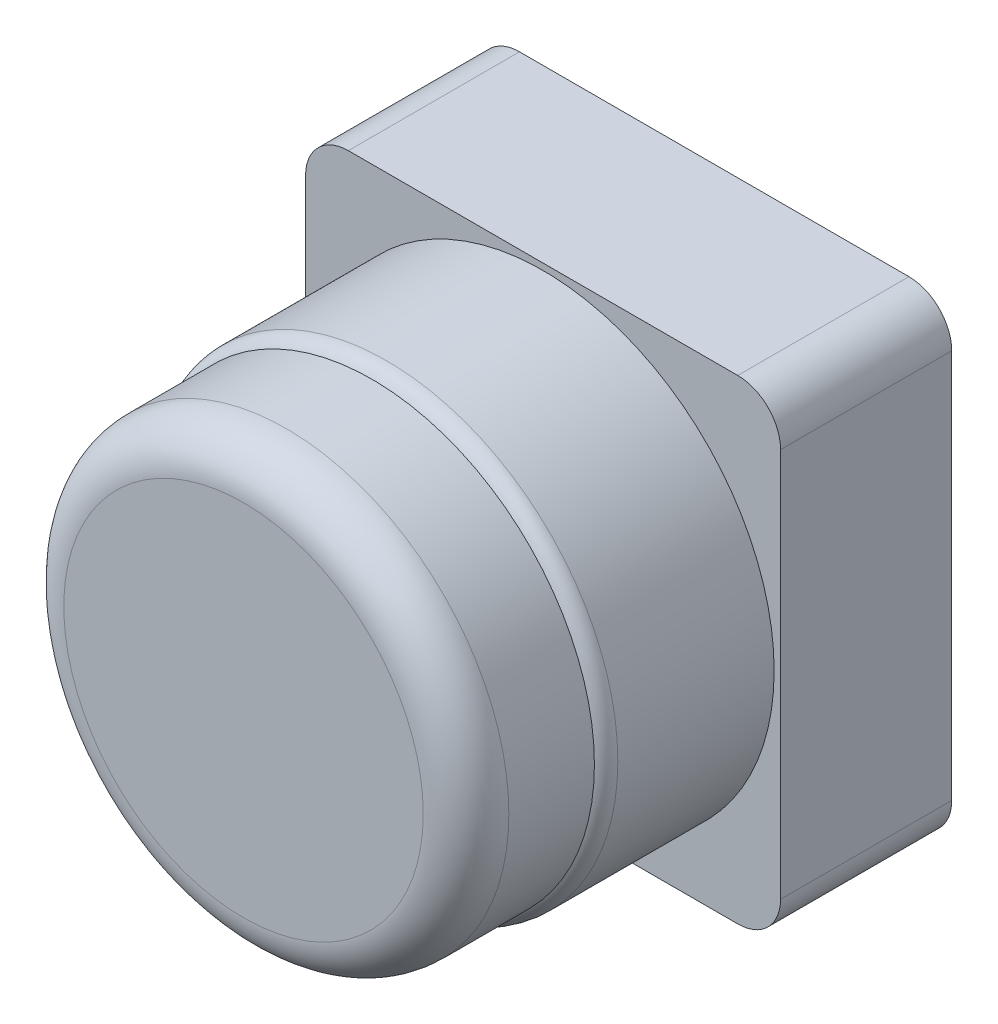
ISO-10303-21;
HEADER;
FILE_DESCRIPTION(('STEP AP214'),'2;1');
FILE_NAME('part.step','',(''),(''),'','','');
FILE_SCHEMA(('AUTOMOTIVE_DESIGN { 1 0 10303 214 1 1 1 1 }'));
ENDSEC;
DATA;
#1=APPLICATION_CONTEXT('core data for automotive mechanical design processes');
#2=APPLICATION_PROTOCOL_DEFINITION('international standard','automotive_design',2000,#1);
#3=PRODUCT_CONTEXT('',#1,'mechanical');
#4=PRODUCT('Part','Part','',(#3));
#5=PRODUCT_RELATED_PRODUCT_CATEGORY('part','',(#4));
#6=PRODUCT_DEFINITION_FORMATION('','',#4);
#7=PRODUCT_DEFINITION_CONTEXT('part definition',#1,'design');
#8=PRODUCT_DEFINITION('design','',#6,#7);
#9=PRODUCT_DEFINITION_SHAPE('','',#8);
#10=(LENGTH_UNIT() NAMED_UNIT(*) SI_UNIT(.MILLI.,.METRE.));
#11=(NAMED_UNIT(*) PLANE_ANGLE_UNIT() SI_UNIT($,.RADIAN.));
#12=(NAMED_UNIT(*) SI_UNIT($,.STERADIAN.) SOLID_ANGLE_UNIT());
#13=UNCERTAINTY_MEASURE_WITH_UNIT(LENGTH_MEASURE(1.E-05),#10,'distance_accuracy_value','');
#14=(GEOMETRIC_REPRESENTATION_CONTEXT(3) GLOBAL_UNCERTAINTY_ASSIGNED_CONTEXT((#13)) GLOBAL_UNIT_ASSIGNED_CONTEXT((#10,
#11,#12)) REPRESENTATION_CONTEXT('',''));
#15=CARTESIAN_POINT('',(0.,0.,0.));
#16=DIRECTION('',(0.,0.,1.));
#17=DIRECTION('',(1.,0.,0.));
#18=AXIS2_PLACEMENT_3D('',#15,#16,#17);
#19=CARTESIAN_POINT('',(-27.75,27.75,20.));
#20=DIRECTION('',(1.,0.,0.));
#21=DIRECTION('',(0.,1.,0.));
#22=AXIS2_PLACEMENT_3D('',#19,#20,#21);
#23=PLANE('',#22);
#24=DIRECTION('',(0.,-1.,0.));
#25=VECTOR('',#24,1.);
#26=CARTESIAN_POINT('',(-27.75,27.75,20.));
#27=LINE('',#26,#25);
#28=CARTESIAN_POINT('',(-27.75,22.75,20.));
#29=VERTEX_POINT('',#28);
#30=CARTESIAN_POINT('',(-27.75,-22.75,20.));
#31=VERTEX_POINT('',#30);
#32=EDGE_CURVE('E205',#29,#31,#27,.T.);
#33=ORIENTED_EDGE('',*,*,#32,.F.);
#34=DIRECTION('',(0.,0.,-1.));
#35=VECTOR('',#34,1.);
#36=CARTESIAN_POINT('',(-27.75,22.75,20.));
#37=LINE('',#36,#35);
#38=CARTESIAN_POINT('',(-27.75,22.75,0.));
#39=VERTEX_POINT('',#38);
#40=EDGE_CURVE('E235',#29,#39,#37,.T.);
#41=ORIENTED_EDGE('',*,*,#40,.T.);
#42=DIRECTION('',(0.,-1.,0.));
#43=VECTOR('',#42,1.);
#44=CARTESIAN_POINT('',(-27.75,27.75,0.));
#45=LINE('',#44,#43);
#46=CARTESIAN_POINT('',(-27.75,-22.75,0.));
#47=VERTEX_POINT('',#46);
#48=EDGE_CURVE('E194',#39,#47,#45,.T.);
#49=ORIENTED_EDGE('',*,*,#48,.T.);
#50=DIRECTION('',(0.,0.,-1.));
#51=VECTOR('',#50,1.);
#52=CARTESIAN_POINT('',(-27.75,-22.75,20.));
#53=LINE('',#52,#51);
#54=EDGE_CURVE('E233',#47,#31,#53,.F.);
#55=ORIENTED_EDGE('',*,*,#54,.T.);
#56=EDGE_LOOP('',(#33,#41,#49,#55));
#57=FACE_BOUND('',#56,.T.);
#58=ADVANCED_FACE('F38',(#57),#23,.F.);
#59=CARTESIAN_POINT('',(-27.75,-27.75,20.));
#60=DIRECTION('',(0.,1.,0.));
#61=DIRECTION('',(0.,0.,1.));
#62=AXIS2_PLACEMENT_3D('',#59,#60,#61);
#63=PLANE('',#62);
#64=DIRECTION('',(0.,0.,-1.));
#65=VECTOR('',#64,1.);
#66=CARTESIAN_POINT('',(5.,-27.75,0.));
#67=LINE('',#66,#65);
#68=CARTESIAN_POINT('',(5.,-27.75,5.));
#69=VERTEX_POINT('',#68);
#70=CARTESIAN_POINT('',(5.,-27.75,1.));
#71=VERTEX_POINT('',#70);
#72=EDGE_CURVE('E157',#69,#71,#67,.T.);
#73=ORIENTED_EDGE('',*,*,#72,.T.);
#74=DIRECTION('',(1.,0.,0.));
#75=VECTOR('',#74,1.);
#76=CARTESIAN_POINT('',(0.,-27.75,1.));
#77=LINE('',#76,#75);
#78=CARTESIAN_POINT('',(-5.,-27.75,1.));
#79=VERTEX_POINT('',#78);
#80=EDGE_CURVE('E53',#79,#71,#77,.T.);
#81=ORIENTED_EDGE('',*,*,#80,.F.);
#82=DIRECTION('',(0.,0.,-1.));
#83=VECTOR('',#82,1.);
#84=CARTESIAN_POINT('',(-5.,-27.75,0.));
#85=LINE('',#84,#83);
#86=CARTESIAN_POINT('',(-5.,-27.75,5.));
#87=VERTEX_POINT('',#86);
#88=EDGE_CURVE('E148',#87,#79,#85,.T.);
#89=ORIENTED_EDGE('',*,*,#88,.F.);
#90=DIRECTION('',(1.,0.,0.));
#91=VECTOR('',#90,1.);
#92=CARTESIAN_POINT('',(0.,-27.75,5.));
#93=LINE('',#92,#91);
#94=EDGE_CURVE('E151',#87,#69,#93,.T.);
#95=ORIENTED_EDGE('',*,*,#94,.T.);
#96=EDGE_LOOP('',(#73,#81,#89,#95));
#97=FACE_BOUND('',#96,.T.);
#98=DIRECTION('',(1.,0.,0.));
#99=VECTOR('',#98,1.);
#100=CARTESIAN_POINT('',(-27.75,-27.75,0.));
#101=LINE('',#100,#99);
#102=CARTESIAN_POINT('',(-22.75,-27.75,0.));
#103=VERTEX_POINT('',#102);
#104=CARTESIAN_POINT('',(22.75,-27.75,0.));
#105=VERTEX_POINT('',#104);
#106=EDGE_CURVE('E218',#103,#105,#101,.T.);
#107=ORIENTED_EDGE('',*,*,#106,.T.);
#108=DIRECTION('',(0.,0.,-1.));
#109=VECTOR('',#108,1.);
#110=CARTESIAN_POINT('',(22.75,-27.75,20.));
#111=LINE('',#110,#109);
#112=CARTESIAN_POINT('',(22.75,-27.75,20.));
#113=VERTEX_POINT('',#112);
#114=EDGE_CURVE('E11',#105,#113,#111,.F.);
#115=ORIENTED_EDGE('',*,*,#114,.T.);
#116=DIRECTION('',(1.,0.,0.));
#117=VECTOR('',#116,1.);
#118=CARTESIAN_POINT('',(-27.75,-27.75,20.));
#119=LINE('',#118,#117);
#120=CARTESIAN_POINT('',(-22.75,-27.75,20.));
#121=VERTEX_POINT('',#120);
#122=EDGE_CURVE('E208',#121,#113,#119,.T.);
#123=ORIENTED_EDGE('',*,*,#122,.F.);
#124=DIRECTION('',(0.,0.,-1.));
#125=VECTOR('',#124,1.);
#126=CARTESIAN_POINT('',(-22.75,-27.75,20.));
#127=LINE('',#126,#125);
#128=EDGE_CURVE('E46',#121,#103,#127,.T.);
#129=ORIENTED_EDGE('',*,*,#128,.T.);
#130=EDGE_LOOP('',(#107,#115,#123,#129));
#131=FACE_BOUND('',#130,.T.);
#132=ADVANCED_FACE('F267',(#97,#131),#63,.F.);
#133=CARTESIAN_POINT('',(27.75,27.75,20.));
#134=DIRECTION('',(-1.,0.,0.));
#135=DIRECTION('',(0.,-1.,0.));
#136=AXIS2_PLACEMENT_3D('',#133,#134,#135);
#137=PLANE('',#136);
#138=DIRECTION('',(0.,1.,0.));
#139=VECTOR('',#138,1.);
#140=CARTESIAN_POINT('',(27.75,27.75,0.));
#141=LINE('',#140,#139);
#142=CARTESIAN_POINT('',(27.75,-22.75,0.));
#143=VERTEX_POINT('',#142);
#144=CARTESIAN_POINT('',(27.75,22.75,0.));
#145=VERTEX_POINT('',#144);
#146=EDGE_CURVE('E221',#143,#145,#141,.T.);
#147=ORIENTED_EDGE('',*,*,#146,.T.);
#148=DIRECTION('',(0.,0.,-1.));
#149=VECTOR('',#148,1.);
#150=CARTESIAN_POINT('',(27.75,22.75,20.));
#151=LINE('',#150,#149);
#152=CARTESIAN_POINT('',(27.75,22.75,20.));
#153=VERTEX_POINT('',#152);
#154=EDGE_CURVE('E61',#145,#153,#151,.F.);
#155=ORIENTED_EDGE('',*,*,#154,.T.);
#156=DIRECTION('',(0.,1.,0.));
#157=VECTOR('',#156,1.);
#158=CARTESIAN_POINT('',(27.75,27.75,20.));
#159=LINE('',#158,#157);
#160=CARTESIAN_POINT('',(27.75,-22.75,20.));
#161=VERTEX_POINT('',#160);
#162=EDGE_CURVE('E212',#161,#153,#159,.T.);
#163=ORIENTED_EDGE('',*,*,#162,.F.);
#164=DIRECTION('',(0.,0.,-1.));
#165=VECTOR('',#164,1.);
#166=CARTESIAN_POINT('',(27.75,-22.75,20.));
#167=LINE('',#166,#165);
#168=EDGE_CURVE('E259',#161,#143,#167,.T.);
#169=ORIENTED_EDGE('',*,*,#168,.T.);
#170=EDGE_LOOP('',(#147,#155,#163,#169));
#171=FACE_BOUND('',#170,.T.);
#172=ADVANCED_FACE('F279',(#171),#137,.F.);
#173=CARTESIAN_POINT('',(-27.75,27.75,20.));
#174=DIRECTION('',(0.,-1.,0.));
#175=DIRECTION('',(0.,0.,-1.));
#176=AXIS2_PLACEMENT_3D('',#173,#174,#175);
#177=PLANE('',#176);
#178=DIRECTION('',(-1.,0.,0.));
#179=VECTOR('',#178,1.);
#180=CARTESIAN_POINT('',(-27.75,27.75,0.));
#181=LINE('',#180,#179);
#182=CARTESIAN_POINT('',(22.75,27.75,0.));
#183=VERTEX_POINT('',#182);
#184=CARTESIAN_POINT('',(-22.75,27.75,0.));
#185=VERTEX_POINT('',#184);
#186=EDGE_CURVE('E209',#183,#185,#181,.T.);
#187=ORIENTED_EDGE('',*,*,#186,.T.);
#188=DIRECTION('',(0.,0.,-1.));
#189=VECTOR('',#188,1.);
#190=CARTESIAN_POINT('',(-22.75,27.75,20.));
#191=LINE('',#190,#189);
#192=CARTESIAN_POINT('',(-22.75,27.75,20.));
#193=VERTEX_POINT('',#192);
#194=EDGE_CURVE('E249',#185,#193,#191,.F.);
#195=ORIENTED_EDGE('',*,*,#194,.T.);
#196=DIRECTION('',(-1.,0.,0.));
#197=VECTOR('',#196,1.);
#198=CARTESIAN_POINT('',(-27.75,27.75,20.));
#199=LINE('',#198,#197);
#200=CARTESIAN_POINT('',(22.75,27.75,20.));
#201=VERTEX_POINT('',#200);
#202=EDGE_CURVE('E204',#201,#193,#199,.T.);
#203=ORIENTED_EDGE('',*,*,#202,.F.);
#204=DIRECTION('',(0.,0.,-1.));
#205=VECTOR('',#204,1.);
#206=CARTESIAN_POINT('',(22.75,27.75,20.));
#207=LINE('',#206,#205);
#208=EDGE_CURVE('E246',#201,#183,#207,.T.);
#209=ORIENTED_EDGE('',*,*,#208,.T.);
#210=EDGE_LOOP('',(#187,#195,#203,#209));
#211=FACE_BOUND('',#210,.T.);
#212=ADVANCED_FACE('F289',(#211),#177,.F.);
#213=CARTESIAN_POINT('',(0.,0.,20.));
#214=DIRECTION('',(0.,0.,1.));
#215=DIRECTION('',(1.,0.,0.));
#216=AXIS2_PLACEMENT_3D('',#213,#214,#215);
#217=PLANE('',#216);
#218=CARTESIAN_POINT('',(0.,0.,20.));
#219=DIRECTION('',(0.,0.,1.));
#220=DIRECTION('',(1.,0.,0.));
#221=AXIS2_PLACEMENT_3D('',#218,#219,#220);
#222=CIRCLE('',#221,27.);
#223=CARTESIAN_POINT('',(27.,0.,20.));
#224=VERTEX_POINT('',#223);
#225=EDGE_CURVE('E201',#224,#224,#222,.T.);
#226=ORIENTED_EDGE('',*,*,#225,.F.);
#227=EDGE_LOOP('',(#226));
#228=FACE_BOUND('',#227,.T.);
#229=ORIENTED_EDGE('',*,*,#202,.T.);
#230=CARTESIAN_POINT('',(-22.75,22.75,20.));
#231=DIRECTION('',(0.,0.,1.));
#232=DIRECTION('',(1.,0.,0.));
#233=AXIS2_PLACEMENT_3D('',#230,#231,#232);
#234=CIRCLE('',#233,5.);
#235=EDGE_CURVE('E257',#193,#29,#234,.T.);
#236=ORIENTED_EDGE('',*,*,#235,.T.);
#237=ORIENTED_EDGE('',*,*,#32,.T.);
#238=CARTESIAN_POINT('',(-22.75,-22.75,20.));
#239=DIRECTION('',(0.,0.,1.));
#240=DIRECTION('',(1.,0.,0.));
#241=AXIS2_PLACEMENT_3D('',#238,#239,#240);
#242=CIRCLE('',#241,5.);
#243=EDGE_CURVE('E251',#31,#121,#242,.T.);
#244=ORIENTED_EDGE('',*,*,#243,.T.);
#245=ORIENTED_EDGE('',*,*,#122,.T.);
#246=CARTESIAN_POINT('',(22.75,-22.75,20.));
#247=DIRECTION('',(0.,0.,1.));
#248=DIRECTION('',(1.,0.,0.));
#249=AXIS2_PLACEMENT_3D('',#246,#247,#248);
#250=CIRCLE('',#249,5.);
#251=EDGE_CURVE('E253',#113,#161,#250,.T.);
#252=ORIENTED_EDGE('',*,*,#251,.T.);
#253=ORIENTED_EDGE('',*,*,#162,.T.);
#254=CARTESIAN_POINT('',(22.75,22.75,20.));
#255=DIRECTION('',(0.,0.,1.));
#256=DIRECTION('',(1.,0.,0.));
#257=AXIS2_PLACEMENT_3D('',#254,#255,#256);
#258=CIRCLE('',#257,5.);
#259=EDGE_CURVE('E255',#153,#201,#258,.T.);
#260=ORIENTED_EDGE('',*,*,#259,.T.);
#261=EDGE_LOOP('',(#229,#236,#237,#244,#245,#252,#253,#260));
#262=FACE_BOUND('',#261,.T.);
#263=ADVANCED_FACE('F282',(#228,#262),#217,.T.);
#264=CARTESIAN_POINT('',(0.,0.,0.));
#265=DIRECTION('',(0.,0.,1.));
#266=DIRECTION('',(1.,0.,0.));
#267=AXIS2_PLACEMENT_3D('',#264,#265,#266);
#268=PLANE('',#267);
#269=CARTESIAN_POINT('',(21.75,-21.75,0.));
#270=DIRECTION('',(0.,0.,-1.));
#271=DIRECTION('',(1.,0.,0.));
#272=AXIS2_PLACEMENT_3D('',#269,#270,#271);
#273=CIRCLE('',#272,1.5);
#274=CARTESIAN_POINT('',(23.25,-21.75,0.));
#275=VERTEX_POINT('',#274);
#276=EDGE_CURVE('E186',#275,#275,#273,.T.);
#277=ORIENTED_EDGE('',*,*,#276,.F.);
#278=EDGE_LOOP('',(#277));
#279=FACE_BOUND('',#278,.T.);
#280=CARTESIAN_POINT('',(-21.75,-21.75,0.));
#281=DIRECTION('',(0.,0.,-1.));
#282=DIRECTION('',(-1.,0.,0.));
#283=AXIS2_PLACEMENT_3D('',#280,#281,#282);
#284=CIRCLE('',#283,1.5);
#285=CARTESIAN_POINT('',(-23.25,-21.75,0.));
#286=VERTEX_POINT('',#285);
#287=EDGE_CURVE('E180',#286,#286,#284,.T.);
#288=ORIENTED_EDGE('',*,*,#287,.F.);
#289=EDGE_LOOP('',(#288));
#290=FACE_BOUND('',#289,.T.);
#291=CARTESIAN_POINT('',(-21.75,21.75,0.));
#292=DIRECTION('',(0.,0.,-1.));
#293=DIRECTION('',(1.,0.,0.));
#294=AXIS2_PLACEMENT_3D('',#291,#292,#293);
#295=CIRCLE('',#294,1.5);
#296=CARTESIAN_POINT('',(-20.25,21.75,0.));
#297=VERTEX_POINT('',#296);
#298=EDGE_CURVE('E174',#297,#297,#295,.T.);
#299=ORIENTED_EDGE('',*,*,#298,.F.);
#300=EDGE_LOOP('',(#299));
#301=FACE_BOUND('',#300,.T.);
#302=CARTESIAN_POINT('',(21.75,21.75,0.));
#303=DIRECTION('',(0.,0.,-1.));
#304=DIRECTION('',(-1.,0.,0.));
#305=AXIS2_PLACEMENT_3D('',#302,#303,#304);
#306=CIRCLE('',#305,1.5);
#307=CARTESIAN_POINT('',(20.25,21.75,0.));
#308=VERTEX_POINT('',#307);
#309=EDGE_CURVE('E167',#308,#308,#306,.T.);
#310=ORIENTED_EDGE('',*,*,#309,.F.);
#311=EDGE_LOOP('',(#310));
#312=FACE_BOUND('',#311,.T.);
#313=CARTESIAN_POINT('',(0.,0.,0.));
#314=DIRECTION('',(0.,0.,-1.));
#315=DIRECTION('',(-1.,0.,0.));
#316=AXIS2_PLACEMENT_3D('',#313,#314,#315);
#317=CIRCLE('',#316,1.5);
#318=CARTESIAN_POINT('',(-1.5,0.,0.));
#319=VERTEX_POINT('',#318);
#320=EDGE_CURVE('E170',#319,#319,#317,.T.);
#321=ORIENTED_EDGE('',*,*,#320,.F.);
#322=EDGE_LOOP('',(#321));
#323=FACE_BOUND('',#322,.T.);
#324=ORIENTED_EDGE('',*,*,#48,.F.);
#325=CARTESIAN_POINT('',(-22.75,22.75,0.));
#326=DIRECTION('',(0.,0.,1.));
#327=DIRECTION('',(1.,0.,0.));
#328=AXIS2_PLACEMENT_3D('',#325,#326,#327);
#329=CIRCLE('',#328,5.);
#330=EDGE_CURVE('E244',#39,#185,#329,.F.);
#331=ORIENTED_EDGE('',*,*,#330,.T.);
#332=ORIENTED_EDGE('',*,*,#186,.F.);
#333=CARTESIAN_POINT('',(22.75,22.75,0.));
#334=DIRECTION('',(0.,0.,1.));
#335=DIRECTION('',(1.,0.,0.));
#336=AXIS2_PLACEMENT_3D('',#333,#334,#335);
#337=CIRCLE('',#336,5.);
#338=EDGE_CURVE('E242',#183,#145,#337,.F.);
#339=ORIENTED_EDGE('',*,*,#338,.T.);
#340=ORIENTED_EDGE('',*,*,#146,.F.);
#341=CARTESIAN_POINT('',(22.75,-22.75,0.));
#342=DIRECTION('',(0.,0.,1.));
#343=DIRECTION('',(1.,0.,0.));
#344=AXIS2_PLACEMENT_3D('',#341,#342,#343);
#345=CIRCLE('',#344,5.);
#346=EDGE_CURVE('E240',#143,#105,#345,.F.);
#347=ORIENTED_EDGE('',*,*,#346,.T.);
#348=ORIENTED_EDGE('',*,*,#106,.F.);
#349=CARTESIAN_POINT('',(-22.75,-22.75,0.));
#350=DIRECTION('',(0.,0.,1.));
#351=DIRECTION('',(1.,0.,0.));
#352=AXIS2_PLACEMENT_3D('',#349,#350,#351);
#353=CIRCLE('',#352,5.);
#354=EDGE_CURVE('E238',#103,#47,#353,.F.);
#355=ORIENTED_EDGE('',*,*,#354,.T.);
#356=EDGE_LOOP('',(#324,#331,#332,#339,#340,#347,#348,#355));
#357=FACE_BOUND('',#356,.T.);
#358=ADVANCED_FACE('F273',(#279,#290,#301,#312,#323,#357),#268,.F.);
#359=CARTESIAN_POINT('',(0.,0.,40.));
#360=DIRECTION('',(0.,0.,-1.));
#361=DIRECTION('',(-1.,0.,0.));
#362=AXIS2_PLACEMENT_3D('',#359,#360,#361);
#363=CYLINDRICAL_SURFACE('',#362,27.);
#364=CARTESIAN_POINT('',(0.,0.,38.2679491924311));
#365=DIRECTION('',(0.,0.,1.));
#366=DIRECTION('',(1.,0.,0.));
#367=AXIS2_PLACEMENT_3D('',#364,#365,#366);
#368=CIRCLE('',#367,27.);
#369=CARTESIAN_POINT('',(27.,0.,38.2679491924311));
#370=VERTEX_POINT('',#369);
#371=EDGE_CURVE('E230',#370,#370,#368,.F.);
#372=ORIENTED_EDGE('',*,*,#371,.T.);
#373=EDGE_LOOP('',(#372));
#374=FACE_BOUND('',#373,.T.);
#375=ORIENTED_EDGE('',*,*,#225,.T.);
#376=EDGE_LOOP('',(#375));
#377=FACE_BOUND('',#376,.T.);
#378=ADVANCED_FACE('F353',(#374,#377),#363,.T.);
#379=CARTESIAN_POINT('',(0.,0.,55.));
#380=DIRECTION('',(0.,0.,-1.));
#381=DIRECTION('',(-1.,0.,0.));
#382=AXIS2_PLACEMENT_3D('',#379,#380,#381);
#383=CYLINDRICAL_SURFACE('',#382,26.);
#384=CARTESIAN_POINT('',(0.,0.,50.));
#385=DIRECTION('',(0.,0.,1.));
#386=DIRECTION('',(1.,0.,0.));
#387=AXIS2_PLACEMENT_3D('',#384,#385,#386);
#388=CIRCLE('',#387,26.);
#389=CARTESIAN_POINT('',(26.,0.,50.));
#390=VERTEX_POINT('',#389);
#391=EDGE_CURVE('E227',#390,#390,#388,.F.);
#392=ORIENTED_EDGE('',*,*,#391,.T.);
#393=EDGE_LOOP('',(#392));
#394=FACE_BOUND('',#393,.T.);
#395=CARTESIAN_POINT('',(0.,0.,40.));
#396=DIRECTION('',(0.,0.,1.));
#397=DIRECTION('',(1.,0.,0.));
#398=AXIS2_PLACEMENT_3D('',#395,#396,#397);
#399=CIRCLE('',#398,26.);
#400=CARTESIAN_POINT('',(26.,0.,40.));
#401=VERTEX_POINT('',#400);
#402=EDGE_CURVE('E197',#401,#401,#399,.T.);
#403=ORIENTED_EDGE('',*,*,#402,.T.);
#404=EDGE_LOOP('',(#403));
#405=FACE_BOUND('',#404,.T.);
#406=ADVANCED_FACE('F575',(#394,#405),#383,.T.);
#407=CARTESIAN_POINT('',(0.,0.,55.));
#408=DIRECTION('',(0.,0.,1.));
#409=DIRECTION('',(1.,0.,0.));
#410=AXIS2_PLACEMENT_3D('',#407,#408,#409);
#411=PLANE('',#410);
#412=CARTESIAN_POINT('',(0.,0.,55.));
#413=DIRECTION('',(0.,0.,1.));
#414=DIRECTION('',(1.,0.,0.));
#415=AXIS2_PLACEMENT_3D('',#412,#413,#414);
#416=CIRCLE('',#415,21.);
#417=CARTESIAN_POINT('',(21.,0.,55.));
#418=VERTEX_POINT('',#417);
#419=EDGE_CURVE('E200',#418,#418,#416,.T.);
#420=ORIENTED_EDGE('',*,*,#419,.T.);
#421=EDGE_LOOP('',(#420));
#422=FACE_BOUND('',#421,.T.);
#423=ADVANCED_FACE('F321',(#422),#411,.T.);
#424=CARTESIAN_POINT('',(0.,0.,50.));
#425=DIRECTION('',(0.,0.,1.));
#426=DIRECTION('',(1.,0.,0.));
#427=AXIS2_PLACEMENT_3D('',#424,#425,#426);
#428=TOROIDAL_SURFACE('',#427,21.,5.);
#429=ORIENTED_EDGE('',*,*,#391,.F.);
#430=EDGE_LOOP('',(#429));
#431=FACE_BOUND('',#430,.T.);
#432=ORIENTED_EDGE('',*,*,#419,.F.);
#433=EDGE_LOOP('',(#432));
#434=FACE_BOUND('',#433,.T.);
#435=ADVANCED_FACE('F317',(#431,#434),#428,.T.);
#436=CARTESIAN_POINT('',(0.,0.,38.2679491924311));
#437=DIRECTION('',(0.,0.,1.));
#438=DIRECTION('',(1.,0.,0.));
#439=AXIS2_PLACEMENT_3D('',#436,#437,#438);
#440=TOROIDAL_SURFACE('',#439,25.,2.);
#441=ORIENTED_EDGE('',*,*,#371,.F.);
#442=EDGE_LOOP('',(#441));
#443=FACE_BOUND('',#442,.T.);
#444=ORIENTED_EDGE('',*,*,#402,.F.);
#445=EDGE_LOOP('',(#444));
#446=FACE_BOUND('',#445,.T.);
#447=ADVANCED_FACE('F320',(#443,#446),#440,.T.);
#448=CARTESIAN_POINT('',(-22.75,22.75,20.));
#449=DIRECTION('',(0.,0.,-1.));
#450=DIRECTION('',(-1.,0.,0.));
#451=AXIS2_PLACEMENT_3D('',#448,#449,#450);
#452=CYLINDRICAL_SURFACE('',#451,5.);
#453=ORIENTED_EDGE('',*,*,#235,.F.);
#454=ORIENTED_EDGE('',*,*,#194,.F.);
#455=ORIENTED_EDGE('',*,*,#330,.F.);
#456=ORIENTED_EDGE('',*,*,#40,.F.);
#457=EDGE_LOOP('',(#453,#454,#455,#456));
#458=FACE_BOUND('',#457,.T.);
#459=ADVANCED_FACE('F294',(#458),#452,.T.);
#460=CARTESIAN_POINT('',(22.75,22.75,20.));
#461=DIRECTION('',(0.,0.,-1.));
#462=DIRECTION('',(-1.,0.,0.));
#463=AXIS2_PLACEMENT_3D('',#460,#461,#462);
#464=CYLINDRICAL_SURFACE('',#463,5.);
#465=ORIENTED_EDGE('',*,*,#259,.F.);
#466=ORIENTED_EDGE('',*,*,#154,.F.);
#467=ORIENTED_EDGE('',*,*,#338,.F.);
#468=ORIENTED_EDGE('',*,*,#208,.F.);
#469=EDGE_LOOP('',(#465,#466,#467,#468));
#470=FACE_BOUND('',#469,.T.);
#471=ADVANCED_FACE('F286',(#470),#464,.T.);
#472=CARTESIAN_POINT('',(22.75,-22.75,20.));
#473=DIRECTION('',(0.,0.,-1.));
#474=DIRECTION('',(-1.,0.,0.));
#475=AXIS2_PLACEMENT_3D('',#472,#473,#474);
#476=CYLINDRICAL_SURFACE('',#475,5.);
#477=ORIENTED_EDGE('',*,*,#251,.F.);
#478=ORIENTED_EDGE('',*,*,#114,.F.);
#479=ORIENTED_EDGE('',*,*,#346,.F.);
#480=ORIENTED_EDGE('',*,*,#168,.F.);
#481=EDGE_LOOP('',(#477,#478,#479,#480));
#482=FACE_BOUND('',#481,.T.);
#483=ADVANCED_FACE('F278',(#482),#476,.T.);
#484=CARTESIAN_POINT('',(-22.75,-22.75,20.));
#485=DIRECTION('',(0.,0.,-1.));
#486=DIRECTION('',(-1.,0.,0.));
#487=AXIS2_PLACEMENT_3D('',#484,#485,#486);
#488=CYLINDRICAL_SURFACE('',#487,5.);
#489=ORIENTED_EDGE('',*,*,#243,.F.);
#490=ORIENTED_EDGE('',*,*,#54,.F.);
#491=ORIENTED_EDGE('',*,*,#354,.F.);
#492=ORIENTED_EDGE('',*,*,#128,.F.);
#493=EDGE_LOOP('',(#489,#490,#491,#492));
#494=FACE_BOUND('',#493,.T.);
#495=ADVANCED_FACE('F40',(#494),#488,.T.);
#496=CARTESIAN_POINT('',(0.,0.,10.));
#497=DIRECTION('',(0.,0.,-1.));
#498=DIRECTION('',(-1.,0.,0.));
#499=AXIS2_PLACEMENT_3D('',#496,#497,#498);
#500=CYLINDRICAL_SURFACE('',#499,1.5);
#501=CARTESIAN_POINT('',(0.,0.,10.));
#502=DIRECTION('',(0.,0.,-1.));
#503=DIRECTION('',(-1.,0.,0.));
#504=AXIS2_PLACEMENT_3D('',#501,#502,#503);
#505=CIRCLE('',#504,1.5);
#506=CARTESIAN_POINT('',(-1.5,0.,10.));
#507=VERTEX_POINT('',#506);
#508=EDGE_CURVE('E191',#507,#507,#505,.T.);
#509=ORIENTED_EDGE('',*,*,#508,.F.);
#510=EDGE_LOOP('',(#509));
#511=FACE_BOUND('',#510,.T.);
#512=ORIENTED_EDGE('',*,*,#320,.T.);
#513=EDGE_LOOP('',(#512));
#514=FACE_BOUND('',#513,.T.);
#515=ADVANCED_FACE('F299',(#511,#514),#500,.F.);
#516=CARTESIAN_POINT('',(0.,0.,10.));
#517=DIRECTION('',(0.,0.,-1.));
#518=DIRECTION('',(-1.,0.,0.));
#519=AXIS2_PLACEMENT_3D('',#516,#517,#518);
#520=PLANE('',#519);
#521=ORIENTED_EDGE('',*,*,#508,.T.);
#522=EDGE_LOOP('',(#521));
#523=FACE_BOUND('',#522,.T.);
#524=ADVANCED_FACE('F304',(#523),#520,.T.);
#525=CARTESIAN_POINT('',(21.75,21.75,10.));
#526=DIRECTION('',(0.,0.,-1.));
#527=DIRECTION('',(-1.,0.,0.));
#528=AXIS2_PLACEMENT_3D('',#525,#526,#527);
#529=CYLINDRICAL_SURFACE('',#528,1.5);
#530=CARTESIAN_POINT('',(21.75,21.75,10.));
#531=DIRECTION('',(0.,0.,-1.));
#532=DIRECTION('',(-1.,0.,0.));
#533=AXIS2_PLACEMENT_3D('',#530,#531,#532);
#534=CIRCLE('',#533,1.5);
#535=CARTESIAN_POINT('',(20.25,21.75,10.));
#536=VERTEX_POINT('',#535);
#537=EDGE_CURVE('E171',#536,#536,#534,.T.);
#538=ORIENTED_EDGE('',*,*,#537,.F.);
#539=EDGE_LOOP('',(#538));
#540=FACE_BOUND('',#539,.T.);
#541=ORIENTED_EDGE('',*,*,#309,.T.);
#542=EDGE_LOOP('',(#541));
#543=FACE_BOUND('',#542,.T.);
#544=ADVANCED_FACE('F374',(#540,#543),#529,.F.);
#545=CARTESIAN_POINT('',(21.75,21.75,10.));
#546=DIRECTION('',(0.,0.,-1.));
#547=DIRECTION('',(-1.,0.,0.));
#548=AXIS2_PLACEMENT_3D('',#545,#546,#547);
#549=PLANE('',#548);
#550=ORIENTED_EDGE('',*,*,#537,.T.);
#551=EDGE_LOOP('',(#550));
#552=FACE_BOUND('',#551,.T.);
#553=ADVANCED_FACE('F385',(#552),#549,.T.);
#554=CARTESIAN_POINT('',(-21.75,21.75,10.));
#555=DIRECTION('',(0.,0.,-1.));
#556=DIRECTION('',(-1.,0.,0.));
#557=AXIS2_PLACEMENT_3D('',#554,#555,#556);
#558=CYLINDRICAL_SURFACE('',#557,1.5);
#559=CARTESIAN_POINT('',(-21.75,21.75,10.));
#560=DIRECTION('',(0.,0.,-1.));
#561=DIRECTION('',(1.,0.,0.));
#562=AXIS2_PLACEMENT_3D('',#559,#560,#561);
#563=CIRCLE('',#562,1.5);
#564=CARTESIAN_POINT('',(-20.25,21.75,10.));
#565=VERTEX_POINT('',#564);
#566=EDGE_CURVE('E177',#565,#565,#563,.T.);
#567=ORIENTED_EDGE('',*,*,#566,.F.);
#568=EDGE_LOOP('',(#567));
#569=FACE_BOUND('',#568,.T.);
#570=ORIENTED_EDGE('',*,*,#298,.T.);
#571=EDGE_LOOP('',(#570));
#572=FACE_BOUND('',#571,.T.);
#573=ADVANCED_FACE('F396',(#569,#572),#558,.F.);
#574=CARTESIAN_POINT('',(-21.75,21.75,10.));
#575=DIRECTION('',(0.,0.,1.));
#576=DIRECTION('',(1.,0.,0.));
#577=AXIS2_PLACEMENT_3D('',#574,#575,#576);
#578=PLANE('',#577);
#579=ORIENTED_EDGE('',*,*,#566,.T.);
#580=EDGE_LOOP('',(#579));
#581=FACE_BOUND('',#580,.T.);
#582=ADVANCED_FACE('F407',(#581),#578,.F.);
#583=CARTESIAN_POINT('',(-21.75,-21.75,10.));
#584=DIRECTION('',(0.,0.,-1.));
#585=DIRECTION('',(-1.,0.,0.));
#586=AXIS2_PLACEMENT_3D('',#583,#584,#585);
#587=CYLINDRICAL_SURFACE('',#586,1.5);
#588=CARTESIAN_POINT('',(-21.75,-21.75,10.));
#589=DIRECTION('',(0.,0.,-1.));
#590=DIRECTION('',(-1.,0.,0.));
#591=AXIS2_PLACEMENT_3D('',#588,#589,#590);
#592=CIRCLE('',#591,1.5);
#593=CARTESIAN_POINT('',(-23.25,-21.75,10.));
#594=VERTEX_POINT('',#593);
#595=EDGE_CURVE('E183',#594,#594,#592,.T.);
#596=ORIENTED_EDGE('',*,*,#595,.F.);
#597=EDGE_LOOP('',(#596));
#598=FACE_BOUND('',#597,.T.);
#599=ORIENTED_EDGE('',*,*,#287,.T.);
#600=EDGE_LOOP('',(#599));
#601=FACE_BOUND('',#600,.T.);
#602=ADVANCED_FACE('F418',(#598,#601),#587,.F.);
#603=CARTESIAN_POINT('',(-21.75,-21.75,10.));
#604=DIRECTION('',(0.,0.,-1.));
#605=DIRECTION('',(-1.,0.,0.));
#606=AXIS2_PLACEMENT_3D('',#603,#604,#605);
#607=PLANE('',#606);
#608=ORIENTED_EDGE('',*,*,#595,.T.);
#609=EDGE_LOOP('',(#608));
#610=FACE_BOUND('',#609,.T.);
#611=ADVANCED_FACE('F429',(#610),#607,.T.);
#612=CARTESIAN_POINT('',(21.75,-21.75,10.));
#613=DIRECTION('',(0.,0.,-1.));
#614=DIRECTION('',(-1.,0.,0.));
#615=AXIS2_PLACEMENT_3D('',#612,#613,#614);
#616=CYLINDRICAL_SURFACE('',#615,1.5);
#617=CARTESIAN_POINT('',(21.75,-21.75,10.));
#618=DIRECTION('',(0.,0.,-1.));
#619=DIRECTION('',(1.,0.,0.));
#620=AXIS2_PLACEMENT_3D('',#617,#618,#619);
#621=CIRCLE('',#620,1.5);
#622=CARTESIAN_POINT('',(23.25,-21.75,10.));
#623=VERTEX_POINT('',#622);
#624=EDGE_CURVE('E163',#623,#623,#621,.T.);
#625=ORIENTED_EDGE('',*,*,#624,.F.);
#626=EDGE_LOOP('',(#625));
#627=FACE_BOUND('',#626,.T.);
#628=ORIENTED_EDGE('',*,*,#276,.T.);
#629=EDGE_LOOP('',(#628));
#630=FACE_BOUND('',#629,.T.);
#631=ADVANCED_FACE('F440',(#627,#630),#616,.F.);
#632=CARTESIAN_POINT('',(21.75,-21.75,10.));
#633=DIRECTION('',(0.,0.,1.));
#634=DIRECTION('',(1.,0.,0.));
#635=AXIS2_PLACEMENT_3D('',#632,#633,#634);
#636=PLANE('',#635);
#637=ORIENTED_EDGE('',*,*,#624,.T.);
#638=EDGE_LOOP('',(#637));
#639=FACE_BOUND('',#638,.T.);
#640=ADVANCED_FACE('F451',(#639),#636,.F.);
#641=CARTESIAN_POINT('',(0.,-23.75,1.));
#642=DIRECTION('',(0.,0.,-1.));
#643=DIRECTION('',(-1.,0.,0.));
#644=AXIS2_PLACEMENT_3D('',#641,#642,#643);
#645=PLANE('',#644);
#646=ORIENTED_EDGE('',*,*,#80,.T.);
#647=DIRECTION('',(0.,-1.,0.));
#648=VECTOR('',#647,1.);
#649=CARTESIAN_POINT('',(5.,-23.75,1.));
#650=LINE('',#649,#648);
#651=CARTESIAN_POINT('',(5.,-23.75,1.));
#652=VERTEX_POINT('',#651);
#653=EDGE_CURVE('E132',#652,#71,#650,.T.);
#654=ORIENTED_EDGE('',*,*,#653,.F.);
#655=DIRECTION('',(1.,0.,0.));
#656=VECTOR('',#655,1.);
#657=CARTESIAN_POINT('',(0.,-23.75,1.));
#658=LINE('',#657,#656);
#659=CARTESIAN_POINT('',(-5.,-23.75,1.));
#660=VERTEX_POINT('',#659);
#661=EDGE_CURVE('E139',#660,#652,#658,.T.);
#662=ORIENTED_EDGE('',*,*,#661,.F.);
#663=DIRECTION('',(0.,-1.,0.));
#664=VECTOR('',#663,1.);
#665=CARTESIAN_POINT('',(-5.,-23.75,1.));
#666=LINE('',#665,#664);
#667=EDGE_CURVE('E161',#660,#79,#666,.T.);
#668=ORIENTED_EDGE('',*,*,#667,.T.);
#669=EDGE_LOOP('',(#646,#654,#662,#668));
#670=FACE_BOUND('',#669,.T.);
#671=ADVANCED_FACE('F142',(#670),#645,.F.);
#672=CARTESIAN_POINT('',(-5.,-23.75,0.));
#673=DIRECTION('',(-1.,0.,0.));
#674=DIRECTION('',(0.,0.,1.));
#675=AXIS2_PLACEMENT_3D('',#672,#673,#674);
#676=PLANE('',#675);
#677=ORIENTED_EDGE('',*,*,#88,.T.);
#678=ORIENTED_EDGE('',*,*,#667,.F.);
#679=DIRECTION('',(0.,0.,-1.));
#680=VECTOR('',#679,1.);
#681=CARTESIAN_POINT('',(-5.,-23.75,0.));
#682=LINE('',#681,#680);
#683=CARTESIAN_POINT('',(-5.,-23.75,5.));
#684=VERTEX_POINT('',#683);
#685=EDGE_CURVE('E144',#684,#660,#682,.T.);
#686=ORIENTED_EDGE('',*,*,#685,.F.);
#687=DIRECTION('',(0.,-1.,0.));
#688=VECTOR('',#687,1.);
#689=CARTESIAN_POINT('',(-5.,-23.75,5.));
#690=LINE('',#689,#688);
#691=EDGE_CURVE('E164',#684,#87,#690,.T.);
#692=ORIENTED_EDGE('',*,*,#691,.T.);
#693=EDGE_LOOP('',(#677,#678,#686,#692));
#694=FACE_BOUND('',#693,.T.);
#695=ADVANCED_FACE('F476',(#694),#676,.F.);
#696=CARTESIAN_POINT('',(0.,-23.75,5.));
#697=DIRECTION('',(0.,0.,-1.));
#698=DIRECTION('',(-1.,0.,0.));
#699=AXIS2_PLACEMENT_3D('',#696,#697,#698);
#700=PLANE('',#699);
#701=ORIENTED_EDGE('',*,*,#94,.F.);
#702=ORIENTED_EDGE('',*,*,#691,.F.);
#703=DIRECTION('',(1.,0.,0.));
#704=VECTOR('',#703,1.);
#705=CARTESIAN_POINT('',(0.,-23.75,5.));
#706=LINE('',#705,#704);
#707=CARTESIAN_POINT('',(5.,-23.75,5.));
#708=VERTEX_POINT('',#707);
#709=EDGE_CURVE('E138',#684,#708,#706,.T.);
#710=ORIENTED_EDGE('',*,*,#709,.T.);
#711=DIRECTION('',(0.,-1.,0.));
#712=VECTOR('',#711,1.);
#713=CARTESIAN_POINT('',(5.,-23.75,5.));
#714=LINE('',#713,#712);
#715=EDGE_CURVE('E134',#708,#69,#714,.T.);
#716=ORIENTED_EDGE('',*,*,#715,.T.);
#717=EDGE_LOOP('',(#701,#702,#710,#716));
#718=FACE_BOUND('',#717,.T.);
#719=ADVANCED_FACE('F487',(#718),#700,.T.);
#720=CARTESIAN_POINT('',(5.,-23.75,0.));
#721=DIRECTION('',(-1.,0.,0.));
#722=DIRECTION('',(0.,0.,1.));
#723=AXIS2_PLACEMENT_3D('',#720,#721,#722);
#724=PLANE('',#723);
#725=ORIENTED_EDGE('',*,*,#72,.F.);
#726=ORIENTED_EDGE('',*,*,#715,.F.);
#727=DIRECTION('',(0.,0.,-1.));
#728=VECTOR('',#727,1.);
#729=CARTESIAN_POINT('',(5.,-23.75,0.));
#730=LINE('',#729,#728);
#731=EDGE_CURVE('E129',#708,#652,#730,.T.);
#732=ORIENTED_EDGE('',*,*,#731,.T.);
#733=ORIENTED_EDGE('',*,*,#653,.T.);
#734=EDGE_LOOP('',(#725,#726,#732,#733));
#735=FACE_BOUND('',#734,.T.);
#736=ADVANCED_FACE('F131',(#735),#724,.T.);
#737=CARTESIAN_POINT('',(0.,-23.75,0.));
#738=DIRECTION('',(0.,-1.,0.));
#739=DIRECTION('',(0.,0.,-1.));
#740=AXIS2_PLACEMENT_3D('',#737,#738,#739);
#741=PLANE('',#740);
#742=ORIENTED_EDGE('',*,*,#661,.T.);
#743=ORIENTED_EDGE('',*,*,#731,.F.);
#744=ORIENTED_EDGE('',*,*,#709,.F.);
#745=ORIENTED_EDGE('',*,*,#685,.T.);
#746=EDGE_LOOP('',(#742,#743,#744,#745));
#747=FACE_BOUND('',#746,.T.);
#748=ADVANCED_FACE('F146',(#747),#741,.T.);
#749=CLOSED_SHELL('',(#58,#132,#172,#212,#263,#358,#378,#406,#423,#435,#447,#459,#471,#483,#495,
#515,#524,#544,#553,#573,#582,#602,#611,#631,#640,#671,#695,#719,#736,#748));
#750=MANIFOLD_SOLID_BREP('B2',#749);
#751=ADVANCED_BREP_SHAPE_REPRESENTATION('',(#18,#750),#14);
#752=SHAPE_DEFINITION_REPRESENTATION(#9,#751);
ENDSEC;
END-ISO-10303-21;
